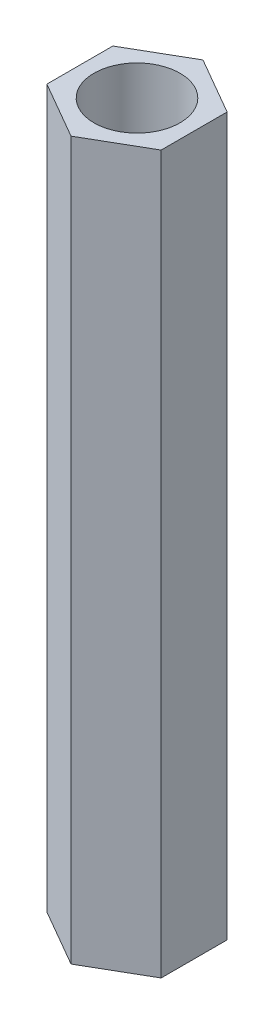
ISO-10303-21;
HEADER;
FILE_DESCRIPTION(('STEP AP214'),'2;1');
FILE_NAME('part.step','',(''),(''),'','','');
FILE_SCHEMA(('AUTOMOTIVE_DESIGN { 1 0 10303 214 1 1 1 1 }'));
ENDSEC;
DATA;
#1=APPLICATION_CONTEXT('core data for automotive mechanical design processes');
#2=APPLICATION_PROTOCOL_DEFINITION('international standard','automotive_design',2000,#1);
#3=PRODUCT_CONTEXT('',#1,'mechanical');
#4=PRODUCT('Part','Part','',(#3));
#5=PRODUCT_RELATED_PRODUCT_CATEGORY('part','',(#4));
#6=PRODUCT_DEFINITION_FORMATION('','',#4);
#7=PRODUCT_DEFINITION_CONTEXT('part definition',#1,'design');
#8=PRODUCT_DEFINITION('design','',#6,#7);
#9=PRODUCT_DEFINITION_SHAPE('','',#8);
#10=(LENGTH_UNIT() NAMED_UNIT(*) SI_UNIT(.MILLI.,.METRE.));
#11=(NAMED_UNIT(*) PLANE_ANGLE_UNIT() SI_UNIT($,.RADIAN.));
#12=(NAMED_UNIT(*) SI_UNIT($,.STERADIAN.) SOLID_ANGLE_UNIT());
#13=UNCERTAINTY_MEASURE_WITH_UNIT(LENGTH_MEASURE(1.E-05),#10,'distance_accuracy_value','');
#14=(GEOMETRIC_REPRESENTATION_CONTEXT(3) GLOBAL_UNCERTAINTY_ASSIGNED_CONTEXT((#13)) GLOBAL_UNIT_ASSIGNED_CONTEXT((#10,
#11,#12)) REPRESENTATION_CONTEXT('',''));
#15=CARTESIAN_POINT('',(0.,0.,0.));
#16=DIRECTION('',(0.,0.,1.));
#17=DIRECTION('',(1.,0.,0.));
#18=AXIS2_PLACEMENT_3D('',#15,#16,#17);
#19=CARTESIAN_POINT('',(0.,25.,0.));
#20=DIRECTION('',(0.,1.,0.));
#21=DIRECTION('',(0.,0.,1.));
#22=AXIS2_PLACEMENT_3D('',#19,#20,#21);
#23=PLANE('',#22);
#24=DIRECTION('',(-0.866025403784439,0.,-0.5));
#25=VECTOR('',#24,1.);
#26=CARTESIAN_POINT('',(1.99185842870421,25.,-1.15));
#27=LINE('',#26,#25);
#28=CARTESIAN_POINT('',(1.99185842870421,25.,-1.15));
#29=VERTEX_POINT('',#28);
#30=CARTESIAN_POINT('',(0.,25.,-2.3));
#31=VERTEX_POINT('',#30);
#32=EDGE_CURVE('E137',#29,#31,#27,.T.);
#33=ORIENTED_EDGE('',*,*,#32,.T.);
#34=DIRECTION('',(-0.866025403784439,0.,0.5));
#35=VECTOR('',#34,1.);
#36=CARTESIAN_POINT('',(0.,25.,-2.3));
#37=LINE('',#36,#35);
#38=CARTESIAN_POINT('',(-1.99185842870421,25.,-1.15));
#39=VERTEX_POINT('',#38);
#40=EDGE_CURVE('E95',#31,#39,#37,.T.);
#41=ORIENTED_EDGE('',*,*,#40,.T.);
#42=DIRECTION('',(0.,0.,1.));
#43=VECTOR('',#42,1.);
#44=CARTESIAN_POINT('',(-1.99185842870421,25.,-1.15));
#45=LINE('',#44,#43);
#46=CARTESIAN_POINT('',(-1.99185842870421,25.,1.15));
#47=VERTEX_POINT('',#46);
#48=EDGE_CURVE('E108',#39,#47,#45,.T.);
#49=ORIENTED_EDGE('',*,*,#48,.T.);
#50=DIRECTION('',(0.866025403784439,0.,0.5));
#51=VECTOR('',#50,1.);
#52=CARTESIAN_POINT('',(-1.99185842870421,25.,1.15));
#53=LINE('',#52,#51);
#54=CARTESIAN_POINT('',(0.,25.,2.3));
#55=VERTEX_POINT('',#54);
#56=EDGE_CURVE('E102',#47,#55,#53,.T.);
#57=ORIENTED_EDGE('',*,*,#56,.T.);
#58=DIRECTION('',(0.866025403784439,0.,-0.5));
#59=VECTOR('',#58,1.);
#60=CARTESIAN_POINT('',(0.,25.,2.3));
#61=LINE('',#60,#59);
#62=CARTESIAN_POINT('',(1.99185842870421,25.,1.15));
#63=VERTEX_POINT('',#62);
#64=EDGE_CURVE('E106',#55,#63,#61,.T.);
#65=ORIENTED_EDGE('',*,*,#64,.T.);
#66=DIRECTION('',(0.,0.,-1.));
#67=VECTOR('',#66,1.);
#68=CARTESIAN_POINT('',(1.99185842870421,25.,1.15));
#69=LINE('',#68,#67);
#70=EDGE_CURVE('E58',#63,#29,#69,.T.);
#71=ORIENTED_EDGE('',*,*,#70,.T.);
#72=EDGE_LOOP('',(#33,#41,#49,#57,#65,#71));
#73=FACE_BOUND('',#72,.T.);
#74=CARTESIAN_POINT('',(0.,25.,0.));
#75=DIRECTION('',(0.,1.,0.));
#76=DIRECTION('',(0.,0.,1.));
#77=AXIS2_PLACEMENT_3D('',#74,#75,#76);
#78=CIRCLE('',#77,1.5);
#79=CARTESIAN_POINT('',(0.,25.,1.5));
#80=VERTEX_POINT('',#79);
#81=EDGE_CURVE('E130',#80,#80,#78,.T.);
#82=ORIENTED_EDGE('',*,*,#81,.F.);
#83=EDGE_LOOP('',(#82));
#84=FACE_BOUND('',#83,.T.);
#85=ADVANCED_FACE('F41',(#73,#84),#23,.T.);
#86=CARTESIAN_POINT('',(0.,0.,0.));
#87=DIRECTION('',(0.,1.,0.));
#88=DIRECTION('',(0.,0.,1.));
#89=AXIS2_PLACEMENT_3D('',#86,#87,#88);
#90=PLANE('',#89);
#91=DIRECTION('',(-0.866025403784439,0.,-0.5));
#92=VECTOR('',#91,1.);
#93=CARTESIAN_POINT('',(1.99185842870421,0.,-1.15));
#94=LINE('',#93,#92);
#95=CARTESIAN_POINT('',(1.99185842870421,0.,-1.15));
#96=VERTEX_POINT('',#95);
#97=CARTESIAN_POINT('',(0.,0.,-2.3));
#98=VERTEX_POINT('',#97);
#99=EDGE_CURVE('E126',#96,#98,#94,.T.);
#100=ORIENTED_EDGE('',*,*,#99,.F.);
#101=DIRECTION('',(0.,0.,-1.));
#102=VECTOR('',#101,1.);
#103=CARTESIAN_POINT('',(1.99185842870421,0.,1.15));
#104=LINE('',#103,#102);
#105=CARTESIAN_POINT('',(1.99185842870421,0.,1.15));
#106=VERTEX_POINT('',#105);
#107=EDGE_CURVE('E87',#106,#96,#104,.T.);
#108=ORIENTED_EDGE('',*,*,#107,.F.);
#109=DIRECTION('',(0.866025403784439,0.,-0.5));
#110=VECTOR('',#109,1.);
#111=CARTESIAN_POINT('',(0.,0.,2.3));
#112=LINE('',#111,#110);
#113=CARTESIAN_POINT('',(0.,0.,2.3));
#114=VERTEX_POINT('',#113);
#115=EDGE_CURVE('E81',#114,#106,#112,.T.);
#116=ORIENTED_EDGE('',*,*,#115,.F.);
#117=DIRECTION('',(0.866025403784439,0.,0.5));
#118=VECTOR('',#117,1.);
#119=CARTESIAN_POINT('',(-1.99185842870421,0.,1.15));
#120=LINE('',#119,#118);
#121=CARTESIAN_POINT('',(-1.99185842870421,0.,1.15));
#122=VERTEX_POINT('',#121);
#123=EDGE_CURVE('E116',#122,#114,#120,.T.);
#124=ORIENTED_EDGE('',*,*,#123,.F.);
#125=DIRECTION('',(0.,0.,1.));
#126=VECTOR('',#125,1.);
#127=CARTESIAN_POINT('',(-1.99185842870421,0.,-1.15));
#128=LINE('',#127,#126);
#129=CARTESIAN_POINT('',(-1.99185842870421,0.,-1.15));
#130=VERTEX_POINT('',#129);
#131=EDGE_CURVE('E132',#130,#122,#128,.T.);
#132=ORIENTED_EDGE('',*,*,#131,.F.);
#133=DIRECTION('',(-0.866025403784439,0.,0.5));
#134=VECTOR('',#133,1.);
#135=CARTESIAN_POINT('',(0.,0.,-2.3));
#136=LINE('',#135,#134);
#137=EDGE_CURVE('E129',#98,#130,#136,.T.);
#138=ORIENTED_EDGE('',*,*,#137,.F.);
#139=EDGE_LOOP('',(#100,#108,#116,#124,#132,#138));
#140=FACE_BOUND('',#139,.T.);
#141=CARTESIAN_POINT('',(0.,0.,0.));
#142=DIRECTION('',(0.,1.,0.));
#143=DIRECTION('',(0.,0.,1.));
#144=AXIS2_PLACEMENT_3D('',#141,#142,#143);
#145=CIRCLE('',#144,1.5);
#146=CARTESIAN_POINT('',(0.,0.,1.5));
#147=VERTEX_POINT('',#146);
#148=EDGE_CURVE('E230',#147,#147,#145,.T.);
#149=ORIENTED_EDGE('',*,*,#148,.T.);
#150=EDGE_LOOP('',(#149));
#151=FACE_BOUND('',#150,.T.);
#152=ADVANCED_FACE('F146',(#140,#151),#90,.F.);
#153=CARTESIAN_POINT('',(1.99185842870421,25.,-1.15));
#154=DIRECTION('',(-0.5,0.,0.866025403784439));
#155=DIRECTION('',(0.866025403784439,0.,0.5));
#156=AXIS2_PLACEMENT_3D('',#153,#154,#155);
#157=PLANE('',#156);
#158=ORIENTED_EDGE('',*,*,#99,.T.);
#159=DIRECTION('',(0.,-1.,0.));
#160=VECTOR('',#159,1.);
#161=CARTESIAN_POINT('',(0.,25.,-2.3));
#162=LINE('',#161,#160);
#163=EDGE_CURVE('E11',#31,#98,#162,.T.);
#164=ORIENTED_EDGE('',*,*,#163,.F.);
#165=ORIENTED_EDGE('',*,*,#32,.F.);
#166=DIRECTION('',(0.,-1.,0.));
#167=VECTOR('',#166,1.);
#168=CARTESIAN_POINT('',(1.99185842870421,25.,-1.15));
#169=LINE('',#168,#167);
#170=EDGE_CURVE('E122',#29,#96,#169,.T.);
#171=ORIENTED_EDGE('',*,*,#170,.T.);
#172=EDGE_LOOP('',(#158,#164,#165,#171));
#173=FACE_BOUND('',#172,.T.);
#174=ADVANCED_FACE('F43',(#173),#157,.F.);
#175=CARTESIAN_POINT('',(0.,25.,-2.3));
#176=DIRECTION('',(0.5,0.,0.866025403784439));
#177=DIRECTION('',(0.866025403784439,0.,-0.5));
#178=AXIS2_PLACEMENT_3D('',#175,#176,#177);
#179=PLANE('',#178);
#180=ORIENTED_EDGE('',*,*,#137,.T.);
#181=DIRECTION('',(0.,-1.,0.));
#182=VECTOR('',#181,1.);
#183=CARTESIAN_POINT('',(-1.99185842870421,25.,-1.15));
#184=LINE('',#183,#182);
#185=EDGE_CURVE('E50',#39,#130,#184,.T.);
#186=ORIENTED_EDGE('',*,*,#185,.F.);
#187=ORIENTED_EDGE('',*,*,#40,.F.);
#188=ORIENTED_EDGE('',*,*,#163,.T.);
#189=EDGE_LOOP('',(#180,#186,#187,#188));
#190=FACE_BOUND('',#189,.T.);
#191=ADVANCED_FACE('F171',(#190),#179,.F.);
#192=CARTESIAN_POINT('',(-1.99185842870421,25.,-1.15));
#193=DIRECTION('',(1.,0.,0.));
#194=DIRECTION('',(0.,0.,-1.));
#195=AXIS2_PLACEMENT_3D('',#192,#193,#194);
#196=PLANE('',#195);
#197=ORIENTED_EDGE('',*,*,#131,.T.);
#198=DIRECTION('',(0.,-1.,0.));
#199=VECTOR('',#198,1.);
#200=CARTESIAN_POINT('',(-1.99185842870421,25.,1.15));
#201=LINE('',#200,#199);
#202=EDGE_CURVE('E117',#47,#122,#201,.T.);
#203=ORIENTED_EDGE('',*,*,#202,.F.);
#204=ORIENTED_EDGE('',*,*,#48,.F.);
#205=ORIENTED_EDGE('',*,*,#185,.T.);
#206=EDGE_LOOP('',(#197,#203,#204,#205));
#207=FACE_BOUND('',#206,.T.);
#208=ADVANCED_FACE('F143',(#207),#196,.F.);
#209=CARTESIAN_POINT('',(-1.99185842870421,25.,1.15));
#210=DIRECTION('',(0.5,0.,-0.866025403784439));
#211=DIRECTION('',(-0.866025403784439,0.,-0.5));
#212=AXIS2_PLACEMENT_3D('',#209,#210,#211);
#213=PLANE('',#212);
#214=ORIENTED_EDGE('',*,*,#123,.T.);
#215=DIRECTION('',(0.,-1.,0.));
#216=VECTOR('',#215,1.);
#217=CARTESIAN_POINT('',(0.,25.,2.3));
#218=LINE('',#217,#216);
#219=EDGE_CURVE('E113',#55,#114,#218,.T.);
#220=ORIENTED_EDGE('',*,*,#219,.F.);
#221=ORIENTED_EDGE('',*,*,#56,.F.);
#222=ORIENTED_EDGE('',*,*,#202,.T.);
#223=EDGE_LOOP('',(#214,#220,#221,#222));
#224=FACE_BOUND('',#223,.T.);
#225=ADVANCED_FACE('F114',(#224),#213,.F.);
#226=CARTESIAN_POINT('',(0.,25.,2.3));
#227=DIRECTION('',(-0.5,0.,-0.866025403784439));
#228=DIRECTION('',(-0.866025403784439,0.,0.5));
#229=AXIS2_PLACEMENT_3D('',#226,#227,#228);
#230=PLANE('',#229);
#231=ORIENTED_EDGE('',*,*,#115,.T.);
#232=DIRECTION('',(0.,-1.,0.));
#233=VECTOR('',#232,1.);
#234=CARTESIAN_POINT('',(1.99185842870421,25.,1.15));
#235=LINE('',#234,#233);
#236=EDGE_CURVE('E118',#63,#106,#235,.T.);
#237=ORIENTED_EDGE('',*,*,#236,.F.);
#238=ORIENTED_EDGE('',*,*,#64,.F.);
#239=ORIENTED_EDGE('',*,*,#219,.T.);
#240=EDGE_LOOP('',(#231,#237,#238,#239));
#241=FACE_BOUND('',#240,.T.);
#242=ADVANCED_FACE('F120',(#241),#230,.F.);
#243=CARTESIAN_POINT('',(1.99185842870421,25.,1.15));
#244=DIRECTION('',(-1.,0.,0.));
#245=DIRECTION('',(0.,0.,1.));
#246=AXIS2_PLACEMENT_3D('',#243,#244,#245);
#247=PLANE('',#246);
#248=ORIENTED_EDGE('',*,*,#107,.T.);
#249=ORIENTED_EDGE('',*,*,#170,.F.);
#250=ORIENTED_EDGE('',*,*,#70,.F.);
#251=ORIENTED_EDGE('',*,*,#236,.T.);
#252=EDGE_LOOP('',(#248,#249,#250,#251));
#253=FACE_BOUND('',#252,.T.);
#254=ADVANCED_FACE('F151',(#253),#247,.F.);
#255=CARTESIAN_POINT('',(0.,25.,0.));
#256=DIRECTION('',(0.,-1.,0.));
#257=DIRECTION('',(0.,0.,-1.));
#258=AXIS2_PLACEMENT_3D('',#255,#256,#257);
#259=CYLINDRICAL_SURFACE('',#258,1.5);
#260=ORIENTED_EDGE('',*,*,#81,.T.);
#261=EDGE_LOOP('',(#260));
#262=FACE_BOUND('',#261,.T.);
#263=ORIENTED_EDGE('',*,*,#148,.F.);
#264=EDGE_LOOP('',(#263));
#265=FACE_BOUND('',#264,.T.);
#266=ADVANCED_FACE('F153',(#262,#265),#259,.F.);
#267=CLOSED_SHELL('',(#85,#152,#174,#191,#208,#225,#242,#254,#266));
#268=MANIFOLD_SOLID_BREP('B2',#267);
#269=ADVANCED_BREP_SHAPE_REPRESENTATION('',(#18,#268),#14);
#270=SHAPE_DEFINITION_REPRESENTATION(#9,#269);
ENDSEC;
END-ISO-10303-21;
